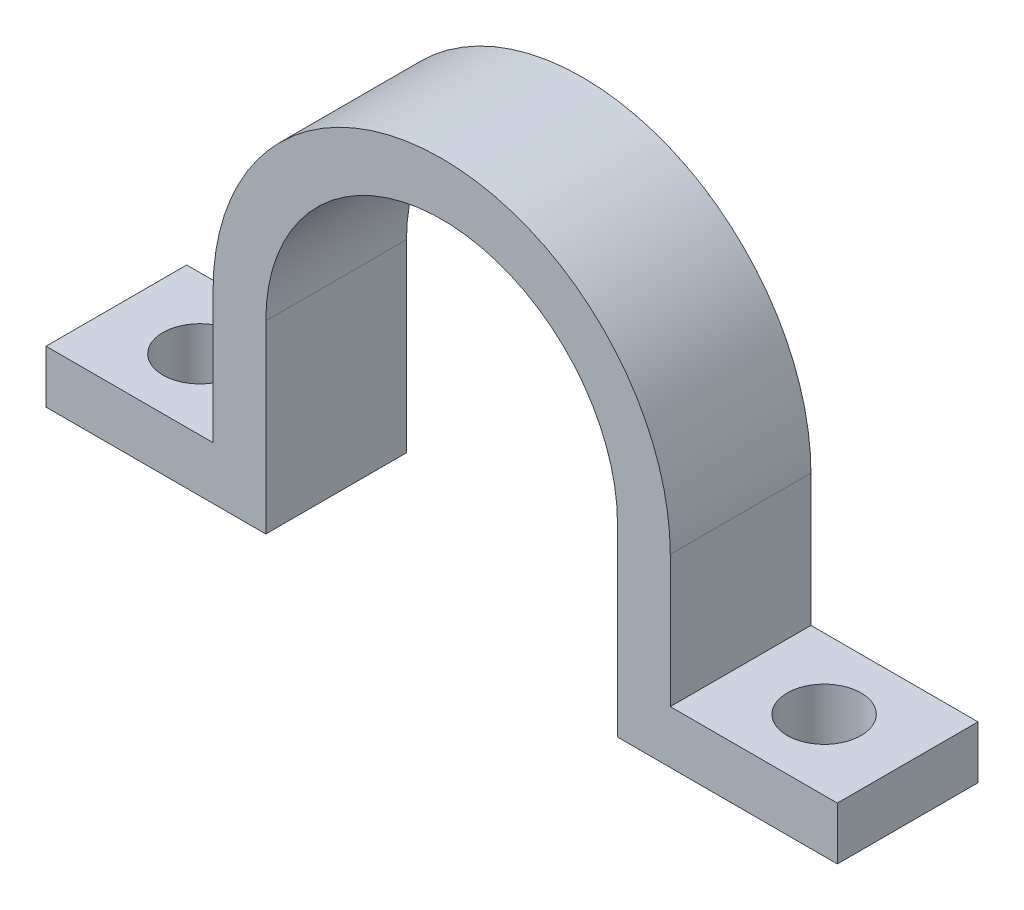
ISO-10303-21;
HEADER;
FILE_DESCRIPTION(('STEP AP214'),'2;1');
FILE_NAME('part.step','',(''),(''),'','','');
FILE_SCHEMA(('AUTOMOTIVE_DESIGN { 1 0 10303 214 1 1 1 1 }'));
ENDSEC;
DATA;
#1=APPLICATION_CONTEXT('core data for automotive mechanical design processes');
#2=APPLICATION_PROTOCOL_DEFINITION('international standard','automotive_design',2000,#1);
#3=PRODUCT_CONTEXT('',#1,'mechanical');
#4=PRODUCT('Part','Part','',(#3));
#5=PRODUCT_RELATED_PRODUCT_CATEGORY('part','',(#4));
#6=PRODUCT_DEFINITION_FORMATION('','',#4);
#7=PRODUCT_DEFINITION_CONTEXT('part definition',#1,'design');
#8=PRODUCT_DEFINITION('design','',#6,#7);
#9=PRODUCT_DEFINITION_SHAPE('','',#8);
#10=(LENGTH_UNIT() NAMED_UNIT(*) SI_UNIT(.MILLI.,.METRE.));
#11=(NAMED_UNIT(*) PLANE_ANGLE_UNIT() SI_UNIT($,.RADIAN.));
#12=(NAMED_UNIT(*) SI_UNIT($,.STERADIAN.) SOLID_ANGLE_UNIT());
#13=UNCERTAINTY_MEASURE_WITH_UNIT(LENGTH_MEASURE(1.E-05),#10,'distance_accuracy_value','');
#14=(GEOMETRIC_REPRESENTATION_CONTEXT(3) GLOBAL_UNCERTAINTY_ASSIGNED_CONTEXT((#13)) GLOBAL_UNIT_ASSIGNED_CONTEXT((#10,
#11,#12)) REPRESENTATION_CONTEXT('',''));
#15=CARTESIAN_POINT('',(0.,0.,0.));
#16=DIRECTION('',(0.,0.,1.));
#17=DIRECTION('',(1.,0.,0.));
#18=AXIS2_PLACEMENT_3D('',#15,#16,#17);
#19=CARTESIAN_POINT('',(0.,0.,8.));
#20=DIRECTION('',(0.,0.,-1.));
#21=DIRECTION('',(-1.,0.,0.));
#22=AXIS2_PLACEMENT_3D('',#19,#20,#21);
#23=CYLINDRICAL_SURFACE('',#22,13.);
#24=CARTESIAN_POINT('',(0.,0.,0.));
#25=DIRECTION('',(0.,0.,1.));
#26=DIRECTION('',(1.,0.,0.));
#27=AXIS2_PLACEMENT_3D('',#24,#25,#26);
#28=CIRCLE('',#27,13.);
#29=CARTESIAN_POINT('',(13.,0.,0.));
#30=VERTEX_POINT('',#29);
#31=CARTESIAN_POINT('',(-13.,0.,0.));
#32=VERTEX_POINT('',#31);
#33=EDGE_CURVE('E159',#30,#32,#28,.T.);
#34=ORIENTED_EDGE('',*,*,#33,.T.);
#35=DIRECTION('',(0.,0.,-1.));
#36=VECTOR('',#35,1.);
#37=CARTESIAN_POINT('',(-13.,0.,8.));
#38=LINE('',#37,#36);
#39=CARTESIAN_POINT('',(-13.,0.,8.));
#40=VERTEX_POINT('',#39);
#41=EDGE_CURVE('E11',#40,#32,#38,.T.);
#42=ORIENTED_EDGE('',*,*,#41,.F.);
#43=CARTESIAN_POINT('',(0.,0.,8.));
#44=DIRECTION('',(0.,0.,1.));
#45=DIRECTION('',(1.,0.,0.));
#46=AXIS2_PLACEMENT_3D('',#43,#44,#45);
#47=CIRCLE('',#46,13.);
#48=CARTESIAN_POINT('',(13.,0.,8.));
#49=VERTEX_POINT('',#48);
#50=EDGE_CURVE('E182',#49,#40,#47,.T.);
#51=ORIENTED_EDGE('',*,*,#50,.F.);
#52=DIRECTION('',(0.,0.,-1.));
#53=VECTOR('',#52,1.);
#54=CARTESIAN_POINT('',(13.,0.,8.));
#55=LINE('',#54,#53);
#56=EDGE_CURVE('E155',#49,#30,#55,.T.);
#57=ORIENTED_EDGE('',*,*,#56,.T.);
#58=EDGE_LOOP('',(#34,#42,#51,#57));
#59=FACE_BOUND('',#58,.T.);
#60=ADVANCED_FACE('F39',(#59),#23,.T.);
#61=CARTESIAN_POINT('',(-13.,0.,8.));
#62=DIRECTION('',(1.,0.,0.));
#63=DIRECTION('',(0.,0.,-1.));
#64=AXIS2_PLACEMENT_3D('',#61,#62,#63);
#65=PLANE('',#64);
#66=DIRECTION('',(0.,-1.,0.));
#67=VECTOR('',#66,1.);
#68=CARTESIAN_POINT('',(-13.,0.,0.));
#69=LINE('',#68,#67);
#70=CARTESIAN_POINT('',(-13.,-7.5,0.));
#71=VERTEX_POINT('',#70);
#72=EDGE_CURVE('E162',#32,#71,#69,.T.);
#73=ORIENTED_EDGE('',*,*,#72,.T.);
#74=DIRECTION('',(0.,0.,-1.));
#75=VECTOR('',#74,1.);
#76=CARTESIAN_POINT('',(-13.,-7.5,8.));
#77=LINE('',#76,#75);
#78=CARTESIAN_POINT('',(-13.,-7.5,8.));
#79=VERTEX_POINT('',#78);
#80=EDGE_CURVE('E47',#79,#71,#77,.T.);
#81=ORIENTED_EDGE('',*,*,#80,.F.);
#82=DIRECTION('',(0.,-1.,0.));
#83=VECTOR('',#82,1.);
#84=CARTESIAN_POINT('',(-13.,0.,8.));
#85=LINE('',#84,#83);
#86=EDGE_CURVE('E110',#40,#79,#85,.T.);
#87=ORIENTED_EDGE('',*,*,#86,.F.);
#88=ORIENTED_EDGE('',*,*,#41,.T.);
#89=EDGE_LOOP('',(#73,#81,#87,#88));
#90=FACE_BOUND('',#89,.T.);
#91=ADVANCED_FACE('F262',(#90),#65,.F.);
#92=CARTESIAN_POINT('',(-22.5,-7.5,8.));
#93=DIRECTION('',(0.,-1.,0.));
#94=DIRECTION('',(0.,0.,-1.));
#95=AXIS2_PLACEMENT_3D('',#92,#93,#94);
#96=PLANE('',#95);
#97=CARTESIAN_POINT('',(-17.75,-7.5,4.));
#98=DIRECTION('',(0.,1.,0.));
#99=DIRECTION('',(0.,0.,1.));
#100=AXIS2_PLACEMENT_3D('',#97,#98,#99);
#101=CIRCLE('',#100,2.1);
#102=CARTESIAN_POINT('',(-17.75,-7.5,6.1));
#103=VERTEX_POINT('',#102);
#104=EDGE_CURVE('E391',#103,#103,#101,.T.);
#105=ORIENTED_EDGE('',*,*,#104,.F.);
#106=EDGE_LOOP('',(#105));
#107=FACE_BOUND('',#106,.T.);
#108=DIRECTION('',(-1.,0.,0.));
#109=VECTOR('',#108,1.);
#110=CARTESIAN_POINT('',(-22.5,-7.5,0.));
#111=LINE('',#110,#109);
#112=CARTESIAN_POINT('',(-22.5,-7.5,0.));
#113=VERTEX_POINT('',#112);
#114=EDGE_CURVE('E165',#71,#113,#111,.T.);
#115=ORIENTED_EDGE('',*,*,#114,.T.);
#116=DIRECTION('',(0.,0.,-1.));
#117=VECTOR('',#116,1.);
#118=CARTESIAN_POINT('',(-22.5,-7.5,8.));
#119=LINE('',#118,#117);
#120=CARTESIAN_POINT('',(-22.5,-7.5,8.));
#121=VERTEX_POINT('',#120);
#122=EDGE_CURVE('E201',#121,#113,#119,.T.);
#123=ORIENTED_EDGE('',*,*,#122,.F.);
#124=DIRECTION('',(-1.,0.,0.));
#125=VECTOR('',#124,1.);
#126=CARTESIAN_POINT('',(-22.5,-7.5,8.));
#127=LINE('',#126,#125);
#128=EDGE_CURVE('E209',#79,#121,#127,.T.);
#129=ORIENTED_EDGE('',*,*,#128,.F.);
#130=ORIENTED_EDGE('',*,*,#80,.T.);
#131=EDGE_LOOP('',(#115,#123,#129,#130));
#132=FACE_BOUND('',#131,.T.);
#133=ADVANCED_FACE('F207',(#107,#132),#96,.F.);
#134=CARTESIAN_POINT('',(-22.5,-10.5,8.));
#135=DIRECTION('',(1.,0.,0.));
#136=DIRECTION('',(0.,0.,-1.));
#137=AXIS2_PLACEMENT_3D('',#134,#135,#136);
#138=PLANE('',#137);
#139=DIRECTION('',(0.,-1.,0.));
#140=VECTOR('',#139,1.);
#141=CARTESIAN_POINT('',(-22.5,-10.5,0.));
#142=LINE('',#141,#140);
#143=CARTESIAN_POINT('',(-22.5,-10.5,0.));
#144=VERTEX_POINT('',#143);
#145=EDGE_CURVE('E167',#113,#144,#142,.T.);
#146=ORIENTED_EDGE('',*,*,#145,.T.);
#147=DIRECTION('',(0.,0.,-1.));
#148=VECTOR('',#147,1.);
#149=CARTESIAN_POINT('',(-22.5,-10.5,8.));
#150=LINE('',#149,#148);
#151=CARTESIAN_POINT('',(-22.5,-10.5,8.));
#152=VERTEX_POINT('',#151);
#153=EDGE_CURVE('E198',#152,#144,#150,.T.);
#154=ORIENTED_EDGE('',*,*,#153,.F.);
#155=DIRECTION('',(0.,-1.,0.));
#156=VECTOR('',#155,1.);
#157=CARTESIAN_POINT('',(-22.5,-10.5,8.));
#158=LINE('',#157,#156);
#159=EDGE_CURVE('E227',#121,#152,#158,.T.);
#160=ORIENTED_EDGE('',*,*,#159,.F.);
#161=ORIENTED_EDGE('',*,*,#122,.T.);
#162=EDGE_LOOP('',(#146,#154,#160,#161));
#163=FACE_BOUND('',#162,.T.);
#164=ADVANCED_FACE('F218',(#163),#138,.F.);
#165=CARTESIAN_POINT('',(-10.,-10.5,8.));
#166=DIRECTION('',(0.,1.,0.));
#167=DIRECTION('',(0.,0.,1.));
#168=AXIS2_PLACEMENT_3D('',#165,#166,#167);
#169=PLANE('',#168);
#170=CARTESIAN_POINT('',(-17.75,-10.5,4.));
#171=DIRECTION('',(0.,1.,0.));
#172=DIRECTION('',(0.,0.,1.));
#173=AXIS2_PLACEMENT_3D('',#170,#171,#172);
#174=CIRCLE('',#173,2.1);
#175=CARTESIAN_POINT('',(-17.75,-10.5,6.1));
#176=VERTEX_POINT('',#175);
#177=EDGE_CURVE('E163',#176,#176,#174,.T.);
#178=ORIENTED_EDGE('',*,*,#177,.T.);
#179=EDGE_LOOP('',(#178));
#180=FACE_BOUND('',#179,.T.);
#181=DIRECTION('',(1.,0.,0.));
#182=VECTOR('',#181,1.);
#183=CARTESIAN_POINT('',(-10.,-10.5,0.));
#184=LINE('',#183,#182);
#185=CARTESIAN_POINT('',(-10.,-10.5,0.));
#186=VERTEX_POINT('',#185);
#187=EDGE_CURVE('E169',#144,#186,#184,.T.);
#188=ORIENTED_EDGE('',*,*,#187,.T.);
#189=DIRECTION('',(0.,0.,-1.));
#190=VECTOR('',#189,1.);
#191=CARTESIAN_POINT('',(-10.,-10.5,8.));
#192=LINE('',#191,#190);
#193=CARTESIAN_POINT('',(-10.,-10.5,8.));
#194=VERTEX_POINT('',#193);
#195=EDGE_CURVE('E195',#194,#186,#192,.T.);
#196=ORIENTED_EDGE('',*,*,#195,.F.);
#197=DIRECTION('',(1.,0.,0.));
#198=VECTOR('',#197,1.);
#199=CARTESIAN_POINT('',(-10.,-10.5,8.));
#200=LINE('',#199,#198);
#201=EDGE_CURVE('E224',#152,#194,#200,.T.);
#202=ORIENTED_EDGE('',*,*,#201,.F.);
#203=ORIENTED_EDGE('',*,*,#153,.T.);
#204=EDGE_LOOP('',(#188,#196,#202,#203));
#205=FACE_BOUND('',#204,.T.);
#206=ADVANCED_FACE('F222',(#180,#205),#169,.F.);
#207=CARTESIAN_POINT('',(-10.,0.,8.));
#208=DIRECTION('',(-1.,0.,0.));
#209=DIRECTION('',(0.,-1.,0.));
#210=AXIS2_PLACEMENT_3D('',#207,#208,#209);
#211=PLANE('',#210);
#212=DIRECTION('',(0.,1.,0.));
#213=VECTOR('',#212,1.);
#214=CARTESIAN_POINT('',(-10.,0.,0.));
#215=LINE('',#214,#213);
#216=CARTESIAN_POINT('',(-10.,0.,0.));
#217=VERTEX_POINT('',#216);
#218=EDGE_CURVE('E171',#186,#217,#215,.T.);
#219=ORIENTED_EDGE('',*,*,#218,.T.);
#220=DIRECTION('',(0.,0.,-1.));
#221=VECTOR('',#220,1.);
#222=CARTESIAN_POINT('',(-10.,0.,8.));
#223=LINE('',#222,#221);
#224=CARTESIAN_POINT('',(-10.,0.,8.));
#225=VERTEX_POINT('',#224);
#226=EDGE_CURVE('E192',#225,#217,#223,.T.);
#227=ORIENTED_EDGE('',*,*,#226,.F.);
#228=DIRECTION('',(0.,1.,0.));
#229=VECTOR('',#228,1.);
#230=CARTESIAN_POINT('',(-10.,0.,8.));
#231=LINE('',#230,#229);
#232=EDGE_CURVE('E226',#194,#225,#231,.T.);
#233=ORIENTED_EDGE('',*,*,#232,.F.);
#234=ORIENTED_EDGE('',*,*,#195,.T.);
#235=EDGE_LOOP('',(#219,#227,#233,#234));
#236=FACE_BOUND('',#235,.T.);
#237=ADVANCED_FACE('F276',(#236),#211,.F.);
#238=CARTESIAN_POINT('',(0.,0.,8.));
#239=DIRECTION('',(0.,0.,-1.));
#240=DIRECTION('',(-1.,0.,0.));
#241=AXIS2_PLACEMENT_3D('',#238,#239,#240);
#242=CYLINDRICAL_SURFACE('',#241,10.);
#243=CARTESIAN_POINT('',(0.,0.,0.));
#244=DIRECTION('',(0.,0.,-1.));
#245=DIRECTION('',(1.,0.,0.));
#246=AXIS2_PLACEMENT_3D('',#243,#244,#245);
#247=CIRCLE('',#246,10.);
#248=CARTESIAN_POINT('',(10.,0.,0.));
#249=VERTEX_POINT('',#248);
#250=EDGE_CURVE('E173',#217,#249,#247,.T.);
#251=ORIENTED_EDGE('',*,*,#250,.T.);
#252=DIRECTION('',(0.,0.,-1.));
#253=VECTOR('',#252,1.);
#254=CARTESIAN_POINT('',(10.,0.,8.));
#255=LINE('',#254,#253);
#256=CARTESIAN_POINT('',(10.,0.,8.));
#257=VERTEX_POINT('',#256);
#258=EDGE_CURVE('E189',#257,#249,#255,.T.);
#259=ORIENTED_EDGE('',*,*,#258,.F.);
#260=CARTESIAN_POINT('',(0.,0.,8.));
#261=DIRECTION('',(0.,0.,-1.));
#262=DIRECTION('',(1.,0.,0.));
#263=AXIS2_PLACEMENT_3D('',#260,#261,#262);
#264=CIRCLE('',#263,10.);
#265=EDGE_CURVE('E229',#225,#257,#264,.T.);
#266=ORIENTED_EDGE('',*,*,#265,.F.);
#267=ORIENTED_EDGE('',*,*,#226,.T.);
#268=EDGE_LOOP('',(#251,#259,#266,#267));
#269=FACE_BOUND('',#268,.T.);
#270=ADVANCED_FACE('F280',(#269),#242,.F.);
#271=CARTESIAN_POINT('',(10.,0.,8.));
#272=DIRECTION('',(1.,0.,0.));
#273=DIRECTION('',(0.,0.,-1.));
#274=AXIS2_PLACEMENT_3D('',#271,#272,#273);
#275=PLANE('',#274);
#276=DIRECTION('',(0.,-1.,0.));
#277=VECTOR('',#276,1.);
#278=CARTESIAN_POINT('',(10.,0.,0.));
#279=LINE('',#278,#277);
#280=CARTESIAN_POINT('',(10.,-10.5,0.));
#281=VERTEX_POINT('',#280);
#282=EDGE_CURVE('E175',#249,#281,#279,.T.);
#283=ORIENTED_EDGE('',*,*,#282,.T.);
#284=DIRECTION('',(0.,0.,-1.));
#285=VECTOR('',#284,1.);
#286=CARTESIAN_POINT('',(10.,-10.5,8.));
#287=LINE('',#286,#285);
#288=CARTESIAN_POINT('',(10.,-10.5,8.));
#289=VERTEX_POINT('',#288);
#290=EDGE_CURVE('E186',#289,#281,#287,.T.);
#291=ORIENTED_EDGE('',*,*,#290,.F.);
#292=DIRECTION('',(0.,-1.,0.));
#293=VECTOR('',#292,1.);
#294=CARTESIAN_POINT('',(10.,0.,8.));
#295=LINE('',#294,#293);
#296=EDGE_CURVE('E235',#257,#289,#295,.T.);
#297=ORIENTED_EDGE('',*,*,#296,.F.);
#298=ORIENTED_EDGE('',*,*,#258,.T.);
#299=EDGE_LOOP('',(#283,#291,#297,#298));
#300=FACE_BOUND('',#299,.T.);
#301=ADVANCED_FACE('F241',(#300),#275,.F.);
#302=CARTESIAN_POINT('',(22.5,-10.5,8.));
#303=DIRECTION('',(0.,1.,0.));
#304=DIRECTION('',(0.,0.,1.));
#305=AXIS2_PLACEMENT_3D('',#302,#303,#304);
#306=PLANE('',#305);
#307=CARTESIAN_POINT('',(17.75,-10.5,4.));
#308=DIRECTION('',(0.,1.,0.));
#309=DIRECTION('',(0.,0.,1.));
#310=AXIS2_PLACEMENT_3D('',#307,#308,#309);
#311=CIRCLE('',#310,2.1);
#312=CARTESIAN_POINT('',(17.75,-10.5,6.1));
#313=VERTEX_POINT('',#312);
#314=EDGE_CURVE('E396',#313,#313,#311,.T.);
#315=ORIENTED_EDGE('',*,*,#314,.T.);
#316=EDGE_LOOP('',(#315));
#317=FACE_BOUND('',#316,.T.);
#318=DIRECTION('',(1.,0.,0.));
#319=VECTOR('',#318,1.);
#320=CARTESIAN_POINT('',(22.5,-10.5,0.));
#321=LINE('',#320,#319);
#322=CARTESIAN_POINT('',(22.5,-10.5,0.));
#323=VERTEX_POINT('',#322);
#324=EDGE_CURVE('E177',#281,#323,#321,.T.);
#325=ORIENTED_EDGE('',*,*,#324,.T.);
#326=DIRECTION('',(0.,0.,-1.));
#327=VECTOR('',#326,1.);
#328=CARTESIAN_POINT('',(22.5,-10.5,8.));
#329=LINE('',#328,#327);
#330=CARTESIAN_POINT('',(22.5,-10.5,8.));
#331=VERTEX_POINT('',#330);
#332=EDGE_CURVE('E150',#331,#323,#329,.T.);
#333=ORIENTED_EDGE('',*,*,#332,.F.);
#334=DIRECTION('',(1.,0.,0.));
#335=VECTOR('',#334,1.);
#336=CARTESIAN_POINT('',(22.5,-10.5,8.));
#337=LINE('',#336,#335);
#338=EDGE_CURVE('E141',#289,#331,#337,.T.);
#339=ORIENTED_EDGE('',*,*,#338,.F.);
#340=ORIENTED_EDGE('',*,*,#290,.T.);
#341=EDGE_LOOP('',(#325,#333,#339,#340));
#342=FACE_BOUND('',#341,.T.);
#343=ADVANCED_FACE('F245',(#317,#342),#306,.F.);
#344=CARTESIAN_POINT('',(22.5,-7.5,8.));
#345=DIRECTION('',(-1.,0.,0.));
#346=DIRECTION('',(0.,0.,1.));
#347=AXIS2_PLACEMENT_3D('',#344,#345,#346);
#348=PLANE('',#347);
#349=DIRECTION('',(0.,1.,0.));
#350=VECTOR('',#349,1.);
#351=CARTESIAN_POINT('',(22.5,-7.5,0.));
#352=LINE('',#351,#350);
#353=CARTESIAN_POINT('',(22.5,-7.5,0.));
#354=VERTEX_POINT('',#353);
#355=EDGE_CURVE('E149',#323,#354,#352,.T.);
#356=ORIENTED_EDGE('',*,*,#355,.T.);
#357=DIRECTION('',(0.,0.,-1.));
#358=VECTOR('',#357,1.);
#359=CARTESIAN_POINT('',(22.5,-7.5,8.));
#360=LINE('',#359,#358);
#361=CARTESIAN_POINT('',(22.5,-7.5,8.));
#362=VERTEX_POINT('',#361);
#363=EDGE_CURVE('E146',#362,#354,#360,.T.);
#364=ORIENTED_EDGE('',*,*,#363,.F.);
#365=DIRECTION('',(0.,1.,0.));
#366=VECTOR('',#365,1.);
#367=CARTESIAN_POINT('',(22.5,-7.5,8.));
#368=LINE('',#367,#366);
#369=EDGE_CURVE('E135',#331,#362,#368,.T.);
#370=ORIENTED_EDGE('',*,*,#369,.F.);
#371=ORIENTED_EDGE('',*,*,#332,.T.);
#372=EDGE_LOOP('',(#356,#364,#370,#371));
#373=FACE_BOUND('',#372,.T.);
#374=ADVANCED_FACE('F147',(#373),#348,.F.);
#375=CARTESIAN_POINT('',(13.,-7.5,8.));
#376=DIRECTION('',(0.,-1.,0.));
#377=DIRECTION('',(0.,0.,-1.));
#378=AXIS2_PLACEMENT_3D('',#375,#376,#377);
#379=PLANE('',#378);
#380=CARTESIAN_POINT('',(17.75,-7.5,4.));
#381=DIRECTION('',(0.,1.,0.));
#382=DIRECTION('',(0.,0.,1.));
#383=AXIS2_PLACEMENT_3D('',#380,#381,#382);
#384=CIRCLE('',#383,2.1);
#385=CARTESIAN_POINT('',(17.75,-7.5,6.1));
#386=VERTEX_POINT('',#385);
#387=EDGE_CURVE('E392',#386,#386,#384,.T.);
#388=ORIENTED_EDGE('',*,*,#387,.F.);
#389=EDGE_LOOP('',(#388));
#390=FACE_BOUND('',#389,.T.);
#391=DIRECTION('',(-1.,0.,0.));
#392=VECTOR('',#391,1.);
#393=CARTESIAN_POINT('',(13.,-7.5,0.));
#394=LINE('',#393,#392);
#395=CARTESIAN_POINT('',(13.,-7.5,0.));
#396=VERTEX_POINT('',#395);
#397=EDGE_CURVE('E96',#354,#396,#394,.T.);
#398=ORIENTED_EDGE('',*,*,#397,.T.);
#399=DIRECTION('',(0.,0.,-1.));
#400=VECTOR('',#399,1.);
#401=CARTESIAN_POINT('',(13.,-7.5,8.));
#402=LINE('',#401,#400);
#403=CARTESIAN_POINT('',(13.,-7.5,8.));
#404=VERTEX_POINT('',#403);
#405=EDGE_CURVE('E151',#404,#396,#402,.T.);
#406=ORIENTED_EDGE('',*,*,#405,.F.);
#407=DIRECTION('',(-1.,0.,0.));
#408=VECTOR('',#407,1.);
#409=CARTESIAN_POINT('',(13.,-7.5,8.));
#410=LINE('',#409,#408);
#411=EDGE_CURVE('E139',#362,#404,#410,.T.);
#412=ORIENTED_EDGE('',*,*,#411,.F.);
#413=ORIENTED_EDGE('',*,*,#363,.T.);
#414=EDGE_LOOP('',(#398,#406,#412,#413));
#415=FACE_BOUND('',#414,.T.);
#416=ADVANCED_FACE('F153',(#390,#415),#379,.F.);
#417=CARTESIAN_POINT('',(13.,0.,8.));
#418=DIRECTION('',(-1.,0.,0.));
#419=DIRECTION('',(0.,0.,1.));
#420=AXIS2_PLACEMENT_3D('',#417,#418,#419);
#421=PLANE('',#420);
#422=DIRECTION('',(0.,1.,0.));
#423=VECTOR('',#422,1.);
#424=CARTESIAN_POINT('',(13.,0.,0.));
#425=LINE('',#424,#423);
#426=EDGE_CURVE('E102',#396,#30,#425,.T.);
#427=ORIENTED_EDGE('',*,*,#426,.T.);
#428=ORIENTED_EDGE('',*,*,#56,.F.);
#429=DIRECTION('',(0.,1.,0.));
#430=VECTOR('',#429,1.);
#431=CARTESIAN_POINT('',(13.,0.,8.));
#432=LINE('',#431,#430);
#433=EDGE_CURVE('E55',#404,#49,#432,.T.);
#434=ORIENTED_EDGE('',*,*,#433,.F.);
#435=ORIENTED_EDGE('',*,*,#405,.T.);
#436=EDGE_LOOP('',(#427,#428,#434,#435));
#437=FACE_BOUND('',#436,.T.);
#438=ADVANCED_FACE('F249',(#437),#421,.F.);
#439=CARTESIAN_POINT('',(0.,0.,8.));
#440=DIRECTION('',(0.,0.,1.));
#441=DIRECTION('',(1.,0.,0.));
#442=AXIS2_PLACEMENT_3D('',#439,#440,#441);
#443=PLANE('',#442);
#444=ORIENTED_EDGE('',*,*,#50,.T.);
#445=ORIENTED_EDGE('',*,*,#86,.T.);
#446=ORIENTED_EDGE('',*,*,#128,.T.);
#447=ORIENTED_EDGE('',*,*,#159,.T.);
#448=ORIENTED_EDGE('',*,*,#201,.T.);
#449=ORIENTED_EDGE('',*,*,#232,.T.);
#450=ORIENTED_EDGE('',*,*,#265,.T.);
#451=ORIENTED_EDGE('',*,*,#296,.T.);
#452=ORIENTED_EDGE('',*,*,#338,.T.);
#453=ORIENTED_EDGE('',*,*,#369,.T.);
#454=ORIENTED_EDGE('',*,*,#411,.T.);
#455=ORIENTED_EDGE('',*,*,#433,.T.);
#456=EDGE_LOOP('',(#444,#445,#446,#447,#448,#449,#450,#451,#452,#453,#454,#455));
#457=FACE_BOUND('',#456,.T.);
#458=ADVANCED_FACE('F137',(#457),#443,.T.);
#459=CARTESIAN_POINT('',(0.,0.,0.));
#460=DIRECTION('',(0.,0.,1.));
#461=DIRECTION('',(1.,0.,0.));
#462=AXIS2_PLACEMENT_3D('',#459,#460,#461);
#463=PLANE('',#462);
#464=ORIENTED_EDGE('',*,*,#33,.F.);
#465=ORIENTED_EDGE('',*,*,#426,.F.);
#466=ORIENTED_EDGE('',*,*,#397,.F.);
#467=ORIENTED_EDGE('',*,*,#355,.F.);
#468=ORIENTED_EDGE('',*,*,#324,.F.);
#469=ORIENTED_EDGE('',*,*,#282,.F.);
#470=ORIENTED_EDGE('',*,*,#250,.F.);
#471=ORIENTED_EDGE('',*,*,#218,.F.);
#472=ORIENTED_EDGE('',*,*,#187,.F.);
#473=ORIENTED_EDGE('',*,*,#145,.F.);
#474=ORIENTED_EDGE('',*,*,#114,.F.);
#475=ORIENTED_EDGE('',*,*,#72,.F.);
#476=EDGE_LOOP('',(#464,#465,#466,#467,#468,#469,#470,#471,#472,#473,#474,#475));
#477=FACE_BOUND('',#476,.T.);
#478=ADVANCED_FACE('F213',(#477),#463,.F.);
#479=CARTESIAN_POINT('',(17.75,-10.5,4.));
#480=DIRECTION('',(0.,1.,0.));
#481=DIRECTION('',(0.,0.,1.));
#482=AXIS2_PLACEMENT_3D('',#479,#480,#481);
#483=CYLINDRICAL_SURFACE('',#482,2.1);
#484=ORIENTED_EDGE('',*,*,#314,.F.);
#485=EDGE_LOOP('',(#484));
#486=FACE_BOUND('',#485,.T.);
#487=ORIENTED_EDGE('',*,*,#387,.T.);
#488=EDGE_LOOP('',(#487));
#489=FACE_BOUND('',#488,.T.);
#490=ADVANCED_FACE('F339',(#486,#489),#483,.F.);
#491=CARTESIAN_POINT('',(-17.75,-10.5,4.));
#492=DIRECTION('',(0.,1.,0.));
#493=DIRECTION('',(0.,0.,1.));
#494=AXIS2_PLACEMENT_3D('',#491,#492,#493);
#495=CYLINDRICAL_SURFACE('',#494,2.1);
#496=ORIENTED_EDGE('',*,*,#177,.F.);
#497=EDGE_LOOP('',(#496));
#498=FACE_BOUND('',#497,.T.);
#499=ORIENTED_EDGE('',*,*,#104,.T.);
#500=EDGE_LOOP('',(#499));
#501=FACE_BOUND('',#500,.T.);
#502=ADVANCED_FACE('F343',(#498,#501),#495,.F.);
#503=CLOSED_SHELL('',(#60,#91,#133,#164,#206,#237,#270,#301,#343,#374,#416,#438,#458,#478,#490,#502));
#504=MANIFOLD_SOLID_BREP('B2',#503);
#505=ADVANCED_BREP_SHAPE_REPRESENTATION('',(#18,#504),#14);
#506=SHAPE_DEFINITION_REPRESENTATION(#9,#505);
ENDSEC;
END-ISO-10303-21;
